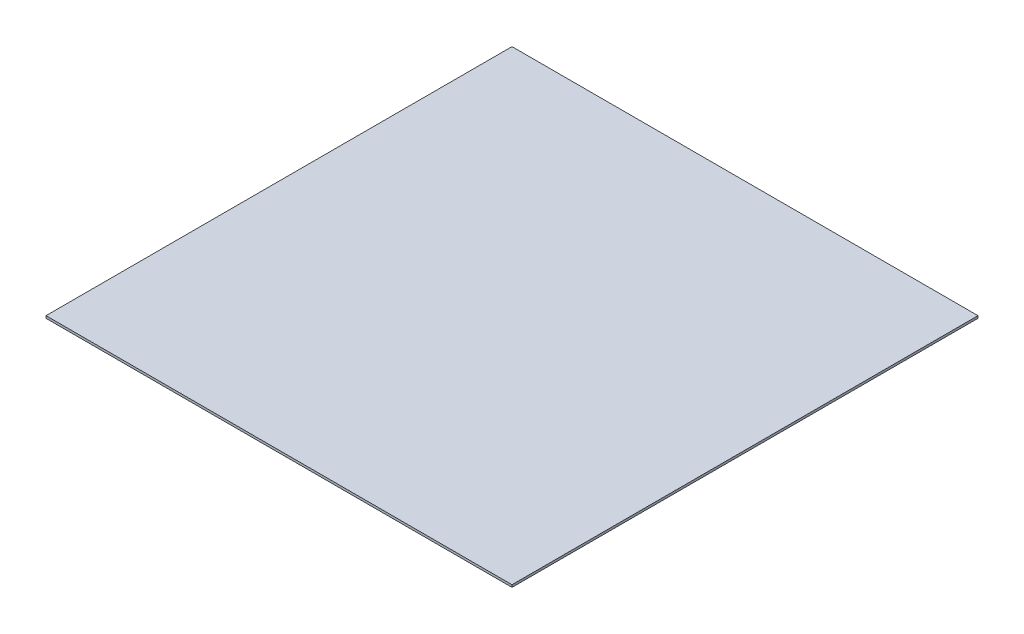
ISO-10303-21;
HEADER;
FILE_DESCRIPTION(('STEP AP214'),'2;1');
FILE_NAME('part.step','',(''),(''),'','','');
FILE_SCHEMA(('AUTOMOTIVE_DESIGN { 1 0 10303 214 1 1 1 1 }'));
ENDSEC;
DATA;
#1=APPLICATION_CONTEXT('core data for automotive mechanical design processes');
#2=APPLICATION_PROTOCOL_DEFINITION('international standard','automotive_design',2000,#1);
#3=PRODUCT_CONTEXT('',#1,'mechanical');
#4=PRODUCT('Part','Part','',(#3));
#5=PRODUCT_RELATED_PRODUCT_CATEGORY('part','',(#4));
#6=PRODUCT_DEFINITION_FORMATION('','',#4);
#7=PRODUCT_DEFINITION_CONTEXT('part definition',#1,'design');
#8=PRODUCT_DEFINITION('design','',#6,#7);
#9=PRODUCT_DEFINITION_SHAPE('','',#8);
#10=(LENGTH_UNIT() NAMED_UNIT(*) SI_UNIT(.MILLI.,.METRE.));
#11=(NAMED_UNIT(*) PLANE_ANGLE_UNIT() SI_UNIT($,.RADIAN.));
#12=(NAMED_UNIT(*) SI_UNIT($,.STERADIAN.) SOLID_ANGLE_UNIT());
#13=UNCERTAINTY_MEASURE_WITH_UNIT(LENGTH_MEASURE(1.E-05),#10,'distance_accuracy_value','');
#14=(GEOMETRIC_REPRESENTATION_CONTEXT(3) GLOBAL_UNCERTAINTY_ASSIGNED_CONTEXT((#13)) GLOBAL_UNIT_ASSIGNED_CONTEXT((#10,
#11,#12)) REPRESENTATION_CONTEXT('',''));
#15=CARTESIAN_POINT('',(0.,0.,0.));
#16=DIRECTION('',(0.,0.,1.));
#17=DIRECTION('',(1.,0.,0.));
#18=AXIS2_PLACEMENT_3D('',#15,#16,#17);
#19=CARTESIAN_POINT('',(1000.,10.,1000.));
#20=DIRECTION('',(-1.,0.,0.));
#21=DIRECTION('',(0.,0.,1.));
#22=AXIS2_PLACEMENT_3D('',#19,#20,#21);
#23=PLANE('',#22);
#24=DIRECTION('',(0.,0.,-1.));
#25=VECTOR('',#24,1.);
#26=CARTESIAN_POINT('',(1000.,0.,1000.));
#27=LINE('',#26,#25);
#28=CARTESIAN_POINT('',(1000.,0.,1000.));
#29=VERTEX_POINT('',#28);
#30=CARTESIAN_POINT('',(1000.,0.,-1000.));
#31=VERTEX_POINT('',#30);
#32=EDGE_CURVE('E111',#29,#31,#27,.T.);
#33=ORIENTED_EDGE('',*,*,#32,.T.);
#34=DIRECTION('',(0.,-1.,0.));
#35=VECTOR('',#34,1.);
#36=CARTESIAN_POINT('',(1000.,10.,-1000.));
#37=LINE('',#36,#35);
#38=CARTESIAN_POINT('',(1000.,10.,-1000.));
#39=VERTEX_POINT('',#38);
#40=EDGE_CURVE('E11',#39,#31,#37,.T.);
#41=ORIENTED_EDGE('',*,*,#40,.F.);
#42=DIRECTION('',(0.,0.,-1.));
#43=VECTOR('',#42,1.);
#44=CARTESIAN_POINT('',(1000.,10.,1000.));
#45=LINE('',#44,#43);
#46=CARTESIAN_POINT('',(1000.,10.,1000.));
#47=VERTEX_POINT('',#46);
#48=EDGE_CURVE('E95',#47,#39,#45,.T.);
#49=ORIENTED_EDGE('',*,*,#48,.F.);
#50=DIRECTION('',(0.,-1.,0.));
#51=VECTOR('',#50,1.);
#52=CARTESIAN_POINT('',(1000.,10.,1000.));
#53=LINE('',#52,#51);
#54=EDGE_CURVE('E107',#47,#29,#53,.T.);
#55=ORIENTED_EDGE('',*,*,#54,.T.);
#56=EDGE_LOOP('',(#33,#41,#49,#55));
#57=FACE_BOUND('',#56,.T.);
#58=ADVANCED_FACE('F43',(#57),#23,.F.);
#59=CARTESIAN_POINT('',(-1000.,10.,-1000.));
#60=DIRECTION('',(0.,0.,1.));
#61=DIRECTION('',(1.,0.,0.));
#62=AXIS2_PLACEMENT_3D('',#59,#60,#61);
#63=PLANE('',#62);
#64=DIRECTION('',(-1.,0.,0.));
#65=VECTOR('',#64,1.);
#66=CARTESIAN_POINT('',(-1000.,0.,-1000.));
#67=LINE('',#66,#65);
#68=CARTESIAN_POINT('',(-1000.,0.,-1000.));
#69=VERTEX_POINT('',#68);
#70=EDGE_CURVE('E100',#31,#69,#67,.T.);
#71=ORIENTED_EDGE('',*,*,#70,.T.);
#72=DIRECTION('',(0.,-1.,0.));
#73=VECTOR('',#72,1.);
#74=CARTESIAN_POINT('',(-1000.,10.,-1000.));
#75=LINE('',#74,#73);
#76=CARTESIAN_POINT('',(-1000.,10.,-1000.));
#77=VERTEX_POINT('',#76);
#78=EDGE_CURVE('E52',#77,#69,#75,.T.);
#79=ORIENTED_EDGE('',*,*,#78,.F.);
#80=DIRECTION('',(-1.,0.,0.));
#81=VECTOR('',#80,1.);
#82=CARTESIAN_POINT('',(-1000.,10.,-1000.));
#83=LINE('',#82,#81);
#84=EDGE_CURVE('E90',#39,#77,#83,.T.);
#85=ORIENTED_EDGE('',*,*,#84,.F.);
#86=ORIENTED_EDGE('',*,*,#40,.T.);
#87=EDGE_LOOP('',(#71,#79,#85,#86));
#88=FACE_BOUND('',#87,.T.);
#89=ADVANCED_FACE('F99',(#88),#63,.F.);
#90=CARTESIAN_POINT('',(-1000.,10.,1000.));
#91=DIRECTION('',(1.,0.,0.));
#92=DIRECTION('',(0.,0.,-1.));
#93=AXIS2_PLACEMENT_3D('',#90,#91,#92);
#94=PLANE('',#93);
#95=DIRECTION('',(0.,0.,1.));
#96=VECTOR('',#95,1.);
#97=CARTESIAN_POINT('',(-1000.,0.,1000.));
#98=LINE('',#97,#96);
#99=CARTESIAN_POINT('',(-1000.,0.,1000.));
#100=VERTEX_POINT('',#99);
#101=EDGE_CURVE('E77',#69,#100,#98,.T.);
#102=ORIENTED_EDGE('',*,*,#101,.T.);
#103=DIRECTION('',(0.,-1.,0.));
#104=VECTOR('',#103,1.);
#105=CARTESIAN_POINT('',(-1000.,10.,1000.));
#106=LINE('',#105,#104);
#107=CARTESIAN_POINT('',(-1000.,10.,1000.));
#108=VERTEX_POINT('',#107);
#109=EDGE_CURVE('E102',#108,#100,#106,.T.);
#110=ORIENTED_EDGE('',*,*,#109,.F.);
#111=DIRECTION('',(0.,0.,1.));
#112=VECTOR('',#111,1.);
#113=CARTESIAN_POINT('',(-1000.,10.,1000.));
#114=LINE('',#113,#112);
#115=EDGE_CURVE('E93',#77,#108,#114,.T.);
#116=ORIENTED_EDGE('',*,*,#115,.F.);
#117=ORIENTED_EDGE('',*,*,#78,.T.);
#118=EDGE_LOOP('',(#102,#110,#116,#117));
#119=FACE_BOUND('',#118,.T.);
#120=ADVANCED_FACE('F103',(#119),#94,.F.);
#121=CARTESIAN_POINT('',(-1000.,10.,1000.));
#122=DIRECTION('',(0.,0.,-1.));
#123=DIRECTION('',(-1.,0.,0.));
#124=AXIS2_PLACEMENT_3D('',#121,#122,#123);
#125=PLANE('',#124);
#126=DIRECTION('',(1.,0.,0.));
#127=VECTOR('',#126,1.);
#128=CARTESIAN_POINT('',(-1000.,0.,1000.));
#129=LINE('',#128,#127);
#130=EDGE_CURVE('E83',#100,#29,#129,.T.);
#131=ORIENTED_EDGE('',*,*,#130,.T.);
#132=ORIENTED_EDGE('',*,*,#54,.F.);
#133=DIRECTION('',(1.,0.,0.));
#134=VECTOR('',#133,1.);
#135=CARTESIAN_POINT('',(-1000.,10.,1000.));
#136=LINE('',#135,#134);
#137=EDGE_CURVE('E60',#108,#47,#136,.T.);
#138=ORIENTED_EDGE('',*,*,#137,.F.);
#139=ORIENTED_EDGE('',*,*,#109,.T.);
#140=EDGE_LOOP('',(#131,#132,#138,#139));
#141=FACE_BOUND('',#140,.T.);
#142=ADVANCED_FACE('F124',(#141),#125,.F.);
#143=CARTESIAN_POINT('',(0.,10.,0.));
#144=DIRECTION('',(0.,-1.,0.));
#145=DIRECTION('',(0.,0.,-1.));
#146=AXIS2_PLACEMENT_3D('',#143,#144,#145);
#147=PLANE('',#146);
#148=ORIENTED_EDGE('',*,*,#48,.T.);
#149=ORIENTED_EDGE('',*,*,#84,.T.);
#150=ORIENTED_EDGE('',*,*,#115,.T.);
#151=ORIENTED_EDGE('',*,*,#137,.T.);
#152=EDGE_LOOP('',(#148,#149,#150,#151));
#153=FACE_BOUND('',#152,.T.);
#154=ADVANCED_FACE('F91',(#153),#147,.F.);
#155=CARTESIAN_POINT('',(0.,0.,0.));
#156=DIRECTION('',(0.,-1.,0.));
#157=DIRECTION('',(0.,0.,-1.));
#158=AXIS2_PLACEMENT_3D('',#155,#156,#157);
#159=PLANE('',#158);
#160=ORIENTED_EDGE('',*,*,#32,.F.);
#161=ORIENTED_EDGE('',*,*,#130,.F.);
#162=ORIENTED_EDGE('',*,*,#101,.F.);
#163=ORIENTED_EDGE('',*,*,#70,.F.);
#164=EDGE_LOOP('',(#160,#161,#162,#163));
#165=FACE_BOUND('',#164,.T.);
#166=ADVANCED_FACE('F127',(#165),#159,.T.);
#167=CLOSED_SHELL('',(#58,#89,#120,#142,#154,#166));
#168=MANIFOLD_SOLID_BREP('B2',#167);
#169=ADVANCED_BREP_SHAPE_REPRESENTATION('',(#18,#168),#14);
#170=SHAPE_DEFINITION_REPRESENTATION(#9,#169);
ENDSEC;
END-ISO-10303-21;
